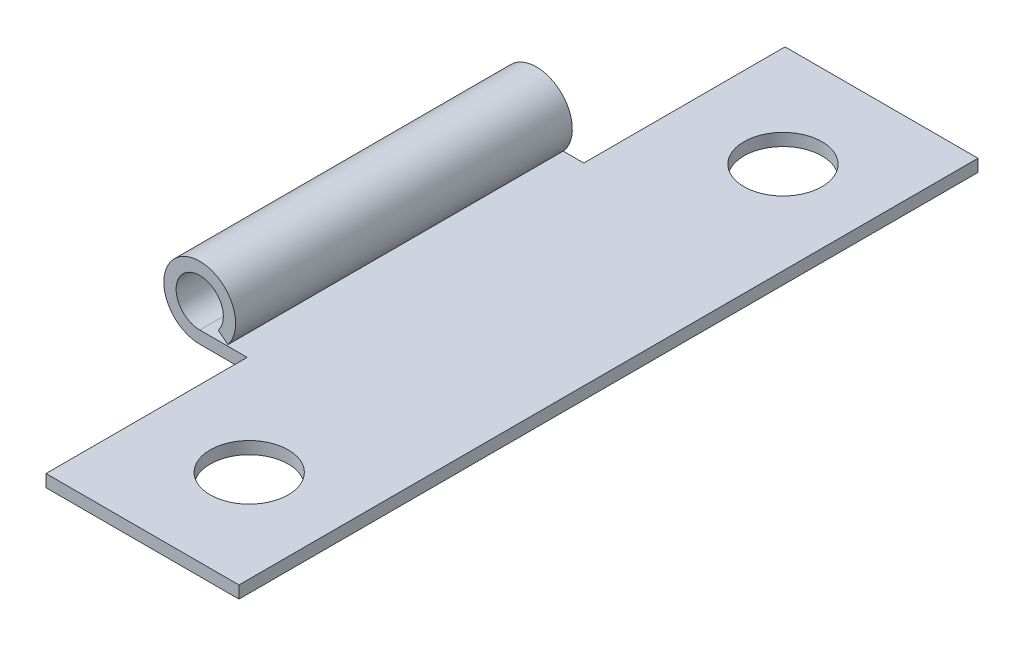
ISO-10303-21;
HEADER;
FILE_DESCRIPTION(('STEP AP214'),'2;1');
FILE_NAME('part.step','',(''),(''),'','','');
FILE_SCHEMA(('AUTOMOTIVE_DESIGN { 1 0 10303 214 1 1 1 1 }'));
ENDSEC;
DATA;
#1=APPLICATION_CONTEXT('core data for automotive mechanical design processes');
#2=APPLICATION_PROTOCOL_DEFINITION('international standard','automotive_design',2000,#1);
#3=PRODUCT_CONTEXT('',#1,'mechanical');
#4=PRODUCT('Part','Part','',(#3));
#5=PRODUCT_RELATED_PRODUCT_CATEGORY('part','',(#4));
#6=PRODUCT_DEFINITION_FORMATION('','',#4);
#7=PRODUCT_DEFINITION_CONTEXT('part definition',#1,'design');
#8=PRODUCT_DEFINITION('design','',#6,#7);
#9=PRODUCT_DEFINITION_SHAPE('','',#8);
#10=(LENGTH_UNIT() NAMED_UNIT(*) SI_UNIT(.MILLI.,.METRE.));
#11=(NAMED_UNIT(*) PLANE_ANGLE_UNIT() SI_UNIT($,.RADIAN.));
#12=(NAMED_UNIT(*) SI_UNIT($,.STERADIAN.) SOLID_ANGLE_UNIT());
#13=UNCERTAINTY_MEASURE_WITH_UNIT(LENGTH_MEASURE(1.E-05),#10,'distance_accuracy_value','');
#14=(GEOMETRIC_REPRESENTATION_CONTEXT(3) GLOBAL_UNCERTAINTY_ASSIGNED_CONTEXT((#13)) GLOBAL_UNIT_ASSIGNED_CONTEXT((#10,
#11,#12)) REPRESENTATION_CONTEXT('',''));
#15=CARTESIAN_POINT('',(0.,0.,0.));
#16=DIRECTION('',(0.,0.,1.));
#17=DIRECTION('',(1.,0.,0.));
#18=AXIS2_PLACEMENT_3D('',#15,#16,#17);
#19=CARTESIAN_POINT('',(-11.7121381015996,0.,36.));
#20=DIRECTION('',(0.,1.,0.));
#21=DIRECTION('',(0.,0.,1.));
#22=AXIS2_PLACEMENT_3D('',#19,#20,#21);
#23=PLANE('',#22);
#24=CARTESIAN_POINT('',(-4.50000000000001,0.,5.));
#25=DIRECTION('',(0.,1.,0.));
#26=DIRECTION('',(-1.,0.,0.));
#27=AXIS2_PLACEMENT_3D('',#24,#25,#26);
#28=CIRCLE('',#27,1.9);
#29=CARTESIAN_POINT('',(-6.40000000000001,0.,5.));
#30=VERTEX_POINT('',#29);
#31=EDGE_CURVE('E155',#30,#30,#28,.T.);
#32=ORIENTED_EDGE('',*,*,#31,.T.);
#33=EDGE_LOOP('',(#32));
#34=FACE_BOUND('',#33,.T.);
#35=CARTESIAN_POINT('',(-4.50000000000001,0.,31.));
#36=DIRECTION('',(0.,1.,0.));
#37=DIRECTION('',(1.,0.,0.));
#38=AXIS2_PLACEMENT_3D('',#35,#36,#37);
#39=CIRCLE('',#38,1.9);
#40=CARTESIAN_POINT('',(-6.40000000000001,0.,31.));
#41=VERTEX_POINT('',#40);
#42=EDGE_CURVE('E162',#41,#41,#39,.T.);
#43=ORIENTED_EDGE('',*,*,#42,.T.);
#44=EDGE_LOOP('',(#43));
#45=FACE_BOUND('',#44,.T.);
#46=DIRECTION('',(1.,0.,0.));
#47=VECTOR('',#46,1.);
#48=CARTESIAN_POINT('',(-11.7121381015996,0.,36.));
#49=LINE('',#48,#47);
#50=CARTESIAN_POINT('',(-9.4,0.,36.));
#51=VERTEX_POINT('',#50);
#52=CARTESIAN_POINT('',(0.,0.,36.));
#53=VERTEX_POINT('',#52);
#54=EDGE_CURVE('E124',#51,#53,#49,.T.);
#55=ORIENTED_EDGE('',*,*,#54,.F.);
#56=DIRECTION('',(0.,0.,-1.));
#57=VECTOR('',#56,1.);
#58=CARTESIAN_POINT('',(-9.4,0.,26.2));
#59=LINE('',#58,#57);
#60=CARTESIAN_POINT('',(-9.4,0.,26.2));
#61=VERTEX_POINT('',#60);
#62=EDGE_CURVE('E46',#51,#61,#59,.T.);
#63=ORIENTED_EDGE('',*,*,#62,.T.);
#64=DIRECTION('',(-1.,0.,0.));
#65=VECTOR('',#64,1.);
#66=CARTESIAN_POINT('',(-9.4,0.,26.2));
#67=LINE('',#66,#65);
#68=CARTESIAN_POINT('',(-11.7121381015996,0.,26.2));
#69=VERTEX_POINT('',#68);
#70=EDGE_CURVE('E113',#61,#69,#67,.T.);
#71=ORIENTED_EDGE('',*,*,#70,.T.);
#72=DIRECTION('',(0.,0.,-1.));
#73=VECTOR('',#72,1.);
#74=CARTESIAN_POINT('',(-11.7121381015996,0.,36.));
#75=LINE('',#74,#73);
#76=CARTESIAN_POINT('',(-11.7121381015996,0.,9.8));
#77=VERTEX_POINT('',#76);
#78=EDGE_CURVE('E174',#69,#77,#75,.T.);
#79=ORIENTED_EDGE('',*,*,#78,.T.);
#80=DIRECTION('',(1.,0.,0.));
#81=VECTOR('',#80,1.);
#82=CARTESIAN_POINT('',(-9.4,0.,9.8));
#83=LINE('',#82,#81);
#84=CARTESIAN_POINT('',(-9.4,0.,9.8));
#85=VERTEX_POINT('',#84);
#86=EDGE_CURVE('E127',#77,#85,#83,.T.);
#87=ORIENTED_EDGE('',*,*,#86,.T.);
#88=DIRECTION('',(0.,0.,-1.));
#89=VECTOR('',#88,1.);
#90=CARTESIAN_POINT('',(-9.4,0.,9.8));
#91=LINE('',#90,#89);
#92=CARTESIAN_POINT('',(-9.4,0.,0.));
#93=VERTEX_POINT('',#92);
#94=EDGE_CURVE('E130',#85,#93,#91,.T.);
#95=ORIENTED_EDGE('',*,*,#94,.T.);
#96=DIRECTION('',(1.,0.,0.));
#97=VECTOR('',#96,1.);
#98=CARTESIAN_POINT('',(-11.7121381015996,0.,0.));
#99=LINE('',#98,#97);
#100=CARTESIAN_POINT('',(0.,0.,0.));
#101=VERTEX_POINT('',#100);
#102=EDGE_CURVE('E158',#93,#101,#99,.T.);
#103=ORIENTED_EDGE('',*,*,#102,.T.);
#104=DIRECTION('',(0.,0.,-1.));
#105=VECTOR('',#104,1.);
#106=CARTESIAN_POINT('',(0.,0.,36.));
#107=LINE('',#106,#105);
#108=EDGE_CURVE('E193',#53,#101,#107,.T.);
#109=ORIENTED_EDGE('',*,*,#108,.F.);
#110=EDGE_LOOP('',(#55,#63,#71,#79,#87,#95,#103,#109));
#111=FACE_BOUND('',#110,.T.);
#112=ADVANCED_FACE('F32',(#34,#45,#111),#23,.F.);
#113=CARTESIAN_POINT('',(0.,0.,36.));
#114=DIRECTION('',(-1.,0.,0.));
#115=DIRECTION('',(0.,0.,1.));
#116=AXIS2_PLACEMENT_3D('',#113,#114,#115);
#117=PLANE('',#116);
#118=DIRECTION('',(0.,1.,0.));
#119=VECTOR('',#118,1.);
#120=CARTESIAN_POINT('',(0.,0.,0.));
#121=LINE('',#120,#119);
#122=CARTESIAN_POINT('',(0.,0.6,0.));
#123=VERTEX_POINT('',#122);
#124=EDGE_CURVE('E176',#101,#123,#121,.T.);
#125=ORIENTED_EDGE('',*,*,#124,.T.);
#126=DIRECTION('',(0.,0.,-1.));
#127=VECTOR('',#126,1.);
#128=CARTESIAN_POINT('',(0.,0.6,36.));
#129=LINE('',#128,#127);
#130=CARTESIAN_POINT('',(0.,0.6,36.));
#131=VERTEX_POINT('',#130);
#132=EDGE_CURVE('E190',#131,#123,#129,.T.);
#133=ORIENTED_EDGE('',*,*,#132,.F.);
#134=DIRECTION('',(0.,1.,0.));
#135=VECTOR('',#134,1.);
#136=CARTESIAN_POINT('',(0.,0.,36.));
#137=LINE('',#136,#135);
#138=EDGE_CURVE('E168',#53,#131,#137,.T.);
#139=ORIENTED_EDGE('',*,*,#138,.F.);
#140=ORIENTED_EDGE('',*,*,#108,.T.);
#141=EDGE_LOOP('',(#125,#133,#139,#140));
#142=FACE_BOUND('',#141,.T.);
#143=ADVANCED_FACE('F214',(#142),#117,.F.);
#144=CARTESIAN_POINT('',(0.,0.6,36.));
#145=DIRECTION('',(0.,-1.,0.));
#146=DIRECTION('',(1.,0.,0.));
#147=AXIS2_PLACEMENT_3D('',#144,#145,#146);
#148=PLANE('',#147);
#149=CARTESIAN_POINT('',(-4.50000000000001,0.600000000000001,5.));
#150=DIRECTION('',(0.,1.,0.));
#151=DIRECTION('',(-1.,0.,0.));
#152=AXIS2_PLACEMENT_3D('',#149,#150,#151);
#153=CIRCLE('',#152,1.9);
#154=CARTESIAN_POINT('',(-6.40000000000001,0.600000000000001,5.));
#155=VERTEX_POINT('',#154);
#156=EDGE_CURVE('E159',#155,#155,#153,.T.);
#157=ORIENTED_EDGE('',*,*,#156,.F.);
#158=EDGE_LOOP('',(#157));
#159=FACE_BOUND('',#158,.T.);
#160=CARTESIAN_POINT('',(-4.50000000000001,0.600000000000001,31.));
#161=DIRECTION('',(0.,1.,0.));
#162=DIRECTION('',(1.,0.,0.));
#163=AXIS2_PLACEMENT_3D('',#160,#161,#162);
#164=CIRCLE('',#163,1.9);
#165=CARTESIAN_POINT('',(-6.40000000000001,0.600000000000001,31.));
#166=VERTEX_POINT('',#165);
#167=EDGE_CURVE('E154',#166,#166,#164,.T.);
#168=ORIENTED_EDGE('',*,*,#167,.F.);
#169=EDGE_LOOP('',(#168));
#170=FACE_BOUND('',#169,.T.);
#171=DIRECTION('',(1.,0.,0.));
#172=VECTOR('',#171,1.);
#173=CARTESIAN_POINT('',(0.,0.6,26.2));
#174=LINE('',#173,#172);
#175=CARTESIAN_POINT('',(-11.7121381015996,0.600000000000001,26.2));
#176=VERTEX_POINT('',#175);
#177=CARTESIAN_POINT('',(-9.4,0.600000000000001,26.2));
#178=VERTEX_POINT('',#177);
#179=EDGE_CURVE('E152',#176,#178,#174,.T.);
#180=ORIENTED_EDGE('',*,*,#179,.T.);
#181=DIRECTION('',(0.,0.,1.));
#182=VECTOR('',#181,1.);
#183=CARTESIAN_POINT('',(-9.4,0.600000000000001,36.));
#184=LINE('',#183,#182);
#185=CARTESIAN_POINT('',(-9.4,0.600000000000001,36.));
#186=VERTEX_POINT('',#185);
#187=EDGE_CURVE('E110',#178,#186,#184,.T.);
#188=ORIENTED_EDGE('',*,*,#187,.T.);
#189=DIRECTION('',(-1.,0.,0.));
#190=VECTOR('',#189,1.);
#191=CARTESIAN_POINT('',(0.,0.6,36.));
#192=LINE('',#191,#190);
#193=EDGE_CURVE('E171',#131,#186,#192,.T.);
#194=ORIENTED_EDGE('',*,*,#193,.F.);
#195=ORIENTED_EDGE('',*,*,#132,.T.);
#196=DIRECTION('',(-1.,0.,0.));
#197=VECTOR('',#196,1.);
#198=CARTESIAN_POINT('',(0.,0.6,0.));
#199=LINE('',#198,#197);
#200=CARTESIAN_POINT('',(-9.4,0.600000000000001,0.));
#201=VERTEX_POINT('',#200);
#202=EDGE_CURVE('E169',#123,#201,#199,.T.);
#203=ORIENTED_EDGE('',*,*,#202,.T.);
#204=DIRECTION('',(0.,0.,1.));
#205=VECTOR('',#204,1.);
#206=CARTESIAN_POINT('',(-9.4,0.600000000000001,36.));
#207=LINE('',#206,#205);
#208=CARTESIAN_POINT('',(-9.4,0.600000000000001,9.8));
#209=VERTEX_POINT('',#208);
#210=EDGE_CURVE('E54',#201,#209,#207,.T.);
#211=ORIENTED_EDGE('',*,*,#210,.T.);
#212=DIRECTION('',(-1.,0.,0.));
#213=VECTOR('',#212,1.);
#214=CARTESIAN_POINT('',(0.,0.6,9.8));
#215=LINE('',#214,#213);
#216=CARTESIAN_POINT('',(-11.7121381015996,0.600000000000001,9.8));
#217=VERTEX_POINT('',#216);
#218=EDGE_CURVE('E143',#209,#217,#215,.T.);
#219=ORIENTED_EDGE('',*,*,#218,.T.);
#220=DIRECTION('',(0.,0.,-1.));
#221=VECTOR('',#220,1.);
#222=CARTESIAN_POINT('',(-11.7121381015996,0.600000000000001,36.));
#223=LINE('',#222,#221);
#224=EDGE_CURVE('E187',#176,#217,#223,.T.);
#225=ORIENTED_EDGE('',*,*,#224,.F.);
#226=EDGE_LOOP('',(#180,#188,#194,#195,#203,#211,#219,#225));
#227=FACE_BOUND('',#226,.T.);
#228=ADVANCED_FACE('F219',(#159,#170,#227),#148,.F.);
#229=CARTESIAN_POINT('',(-11.7121381015996,1.75,36.));
#230=DIRECTION('',(0.,0.,-1.));
#231=DIRECTION('',(-1.,0.,0.));
#232=AXIS2_PLACEMENT_3D('',#229,#230,#231);
#233=CYLINDRICAL_SURFACE('',#232,1.15);
#234=DIRECTION('',(0.,0.,-1.));
#235=VECTOR('',#234,1.);
#236=CARTESIAN_POINT('',(-10.8073046216626,1.04022794251596,36.));
#237=LINE('',#236,#235);
#238=CARTESIAN_POINT('',(-10.8073046216626,1.04022794251596,26.2));
#239=VERTEX_POINT('',#238);
#240=CARTESIAN_POINT('',(-10.8073046216626,1.04022794251596,9.8));
#241=VERTEX_POINT('',#240);
#242=EDGE_CURVE('E184',#239,#241,#237,.T.);
#243=ORIENTED_EDGE('',*,*,#242,.F.);
#244=CARTESIAN_POINT('',(-11.7121381015996,1.75,26.2));
#245=DIRECTION('',(0.,0.,-1.));
#246=DIRECTION('',(-1.,0.,0.));
#247=AXIS2_PLACEMENT_3D('',#244,#245,#246);
#248=CIRCLE('',#247,1.15);
#249=EDGE_CURVE('E149',#239,#176,#248,.F.);
#250=ORIENTED_EDGE('',*,*,#249,.T.);
#251=ORIENTED_EDGE('',*,*,#224,.T.);
#252=CARTESIAN_POINT('',(-11.7121381015996,1.75,9.8));
#253=DIRECTION('',(0.,0.,1.));
#254=DIRECTION('',(1.,0.,0.));
#255=AXIS2_PLACEMENT_3D('',#252,#253,#254);
#256=CIRCLE('',#255,1.15);
#257=EDGE_CURVE('E140',#217,#241,#256,.F.);
#258=ORIENTED_EDGE('',*,*,#257,.T.);
#259=EDGE_LOOP('',(#243,#250,#251,#258));
#260=FACE_BOUND('',#259,.T.);
#261=ADVANCED_FACE('F223',(#260),#233,.F.);
#262=CARTESIAN_POINT('',(-10.8073046216626,1.04022794251596,36.));
#263=DIRECTION('',(0.617193093464386,0.786811721684332,0.));
#264=DIRECTION('',(-0.786811721684332,0.617193093464386,0.));
#265=AXIS2_PLACEMENT_3D('',#262,#263,#264);
#266=PLANE('',#265);
#267=DIRECTION('',(0.,0.,-1.));
#268=VECTOR('',#267,1.);
#269=CARTESIAN_POINT('',(-10.335217588652,0.669912086437324,36.));
#270=LINE('',#269,#268);
#271=CARTESIAN_POINT('',(-10.335217588652,0.669912086437324,26.2));
#272=VERTEX_POINT('',#271);
#273=CARTESIAN_POINT('',(-10.335217588652,0.669912086437324,9.8));
#274=VERTEX_POINT('',#273);
#275=EDGE_CURVE('E181',#272,#274,#270,.T.);
#276=ORIENTED_EDGE('',*,*,#275,.F.);
#277=DIRECTION('',(-0.786811721684332,0.617193093464386,0.));
#278=VECTOR('',#277,1.);
#279=CARTESIAN_POINT('',(-10.8073046216626,1.04022794251596,26.2));
#280=LINE('',#279,#278);
#281=EDGE_CURVE('E146',#272,#239,#280,.T.);
#282=ORIENTED_EDGE('',*,*,#281,.T.);
#283=ORIENTED_EDGE('',*,*,#242,.T.);
#284=DIRECTION('',(0.786811721684332,-0.617193093464386,0.));
#285=VECTOR('',#284,1.);
#286=CARTESIAN_POINT('',(-10.8073046216626,1.04022794251596,9.8));
#287=LINE('',#286,#285);
#288=EDGE_CURVE('E137',#241,#274,#287,.T.);
#289=ORIENTED_EDGE('',*,*,#288,.T.);
#290=EDGE_LOOP('',(#276,#282,#283,#289));
#291=FACE_BOUND('',#290,.T.);
#292=ADVANCED_FACE('F225',(#291),#266,.F.);
#293=CARTESIAN_POINT('',(-11.7121381015996,1.75,36.));
#294=DIRECTION('',(0.,0.,-1.));
#295=DIRECTION('',(-1.,0.,0.));
#296=AXIS2_PLACEMENT_3D('',#293,#294,#295);
#297=CYLINDRICAL_SURFACE('',#296,1.75);
#298=CARTESIAN_POINT('',(-11.7121381015996,1.75,26.2));
#299=DIRECTION('',(0.,0.,-1.));
#300=DIRECTION('',(-1.,0.,0.));
#301=AXIS2_PLACEMENT_3D('',#298,#299,#300);
#302=CIRCLE('',#301,1.75);
#303=EDGE_CURVE('E11',#69,#272,#302,.T.);
#304=ORIENTED_EDGE('',*,*,#303,.T.);
#305=ORIENTED_EDGE('',*,*,#275,.T.);
#306=CARTESIAN_POINT('',(-11.7121381015996,1.75,9.8));
#307=DIRECTION('',(0.,0.,1.));
#308=DIRECTION('',(1.,0.,0.));
#309=AXIS2_PLACEMENT_3D('',#306,#307,#308);
#310=CIRCLE('',#309,1.75);
#311=EDGE_CURVE('E39',#274,#77,#310,.T.);
#312=ORIENTED_EDGE('',*,*,#311,.T.);
#313=ORIENTED_EDGE('',*,*,#78,.F.);
#314=EDGE_LOOP('',(#304,#305,#312,#313));
#315=FACE_BOUND('',#314,.T.);
#316=ADVANCED_FACE('F201',(#315),#297,.T.);
#317=CARTESIAN_POINT('',(-11.7121381015996,1.75,36.));
#318=DIRECTION('',(0.,0.,-1.));
#319=DIRECTION('',(-1.,0.,0.));
#320=AXIS2_PLACEMENT_3D('',#317,#318,#319);
#321=PLANE('',#320);
#322=ORIENTED_EDGE('',*,*,#193,.T.);
#323=DIRECTION('',(0.,-1.,0.));
#324=VECTOR('',#323,1.);
#325=CARTESIAN_POINT('',(-9.4,1.75,36.));
#326=LINE('',#325,#324);
#327=EDGE_CURVE('E198',#186,#51,#326,.T.);
#328=ORIENTED_EDGE('',*,*,#327,.T.);
#329=ORIENTED_EDGE('',*,*,#54,.T.);
#330=ORIENTED_EDGE('',*,*,#138,.T.);
#331=EDGE_LOOP('',(#322,#328,#329,#330));
#332=FACE_BOUND('',#331,.T.);
#333=ADVANCED_FACE('F217',(#332),#321,.F.);
#334=CARTESIAN_POINT('',(-11.7121381015996,1.75,0.));
#335=DIRECTION('',(0.,0.,-1.));
#336=DIRECTION('',(-1.,0.,0.));
#337=AXIS2_PLACEMENT_3D('',#334,#335,#336);
#338=PLANE('',#337);
#339=DIRECTION('',(0.,-1.,0.));
#340=VECTOR('',#339,1.);
#341=CARTESIAN_POINT('',(-9.4,1.75,0.));
#342=LINE('',#341,#340);
#343=EDGE_CURVE('E196',#201,#93,#342,.T.);
#344=ORIENTED_EDGE('',*,*,#343,.F.);
#345=ORIENTED_EDGE('',*,*,#202,.F.);
#346=ORIENTED_EDGE('',*,*,#124,.F.);
#347=ORIENTED_EDGE('',*,*,#102,.F.);
#348=EDGE_LOOP('',(#344,#345,#346,#347));
#349=FACE_BOUND('',#348,.T.);
#350=ADVANCED_FACE('F209',(#349),#338,.T.);
#351=CARTESIAN_POINT('',(-4.50000000000001,0.,31.));
#352=DIRECTION('',(0.,1.,0.));
#353=DIRECTION('',(-1.,0.,0.));
#354=AXIS2_PLACEMENT_3D('',#351,#352,#353);
#355=CYLINDRICAL_SURFACE('',#354,1.9);
#356=CARTESIAN_POINT('',(-6.40000000000001,0.,31.));
#357=CARTESIAN_POINT('',(-6.40000000000001,0.00624999999999882,31.));
#358=CARTESIAN_POINT('',(-6.40000000000001,0.0124999999999988,31.));
#359=CARTESIAN_POINT('',(-6.40000000000001,0.0249999999999989,31.));
#360=CARTESIAN_POINT('',(-6.40000000000001,0.0312499999999989,31.));
#361=CARTESIAN_POINT('',(-6.40000000000001,0.0437499999999989,31.));
#362=CARTESIAN_POINT('',(-6.40000000000001,0.049999999999999,31.));
#363=CARTESIAN_POINT('',(-6.40000000000001,0.062499999999999,31.));
#364=CARTESIAN_POINT('',(-6.40000000000001,0.068749999999999,31.));
#365=CARTESIAN_POINT('',(-6.40000000000001,0.0812499999999991,31.));
#366=CARTESIAN_POINT('',(-6.40000000000001,0.0874999999999991,31.));
#367=CARTESIAN_POINT('',(-6.40000000000001,0.0999999999999991,31.));
#368=CARTESIAN_POINT('',(-6.40000000000001,0.106249999999999,31.));
#369=CARTESIAN_POINT('',(-6.40000000000001,0.118749999999999,31.));
#370=CARTESIAN_POINT('',(-6.40000000000001,0.124999999999999,31.));
#371=CARTESIAN_POINT('',(-6.40000000000001,0.137499999999999,31.));
#372=CARTESIAN_POINT('',(-6.40000000000001,0.143749999999999,31.));
#373=CARTESIAN_POINT('',(-6.40000000000001,0.156249999999999,31.));
#374=CARTESIAN_POINT('',(-6.40000000000001,0.162499999999999,31.));
#375=CARTESIAN_POINT('',(-6.40000000000001,0.174999999999999,31.));
#376=CARTESIAN_POINT('',(-6.40000000000001,0.181249999999999,31.));
#377=CARTESIAN_POINT('',(-6.40000000000001,0.193749999999999,31.));
#378=CARTESIAN_POINT('',(-6.40000000000001,0.199999999999999,31.));
#379=CARTESIAN_POINT('',(-6.40000000000001,0.212499999999999,31.));
#380=CARTESIAN_POINT('',(-6.40000000000001,0.21875,31.));
#381=CARTESIAN_POINT('',(-6.40000000000001,0.23125,31.));
#382=CARTESIAN_POINT('',(-6.40000000000001,0.2375,31.));
#383=CARTESIAN_POINT('',(-6.40000000000001,0.25,31.));
#384=CARTESIAN_POINT('',(-6.40000000000001,0.25625,31.));
#385=CARTESIAN_POINT('',(-6.40000000000001,0.26875,31.));
#386=CARTESIAN_POINT('',(-6.40000000000001,0.275,31.));
#387=CARTESIAN_POINT('',(-6.40000000000001,0.2875,31.));
#388=CARTESIAN_POINT('',(-6.40000000000001,0.29375,31.));
#389=CARTESIAN_POINT('',(-6.40000000000001,0.30625,31.));
#390=CARTESIAN_POINT('',(-6.40000000000001,0.3125,31.));
#391=CARTESIAN_POINT('',(-6.40000000000001,0.325,31.));
#392=CARTESIAN_POINT('',(-6.40000000000001,0.33125,31.));
#393=CARTESIAN_POINT('',(-6.40000000000001,0.34375,31.));
#394=CARTESIAN_POINT('',(-6.40000000000001,0.35,31.));
#395=CARTESIAN_POINT('',(-6.40000000000001,0.3625,31.));
#396=CARTESIAN_POINT('',(-6.40000000000001,0.36875,31.));
#397=CARTESIAN_POINT('',(-6.40000000000001,0.38125,31.));
#398=CARTESIAN_POINT('',(-6.40000000000001,0.3875,31.));
#399=CARTESIAN_POINT('',(-6.40000000000001,0.4,31.));
#400=CARTESIAN_POINT('',(-6.40000000000001,0.40625,31.));
#401=CARTESIAN_POINT('',(-6.40000000000001,0.41875,31.));
#402=CARTESIAN_POINT('',(-6.40000000000001,0.425,31.));
#403=CARTESIAN_POINT('',(-6.40000000000001,0.4375,31.));
#404=CARTESIAN_POINT('',(-6.40000000000001,0.44375,31.));
#405=CARTESIAN_POINT('',(-6.40000000000001,0.45625,31.));
#406=CARTESIAN_POINT('',(-6.40000000000001,0.4625,31.));
#407=CARTESIAN_POINT('',(-6.40000000000001,0.475,31.));
#408=CARTESIAN_POINT('',(-6.40000000000001,0.48125,31.));
#409=CARTESIAN_POINT('',(-6.40000000000001,0.49375,31.));
#410=CARTESIAN_POINT('',(-6.40000000000001,0.5,31.));
#411=CARTESIAN_POINT('',(-6.40000000000001,0.512500000000001,31.));
#412=CARTESIAN_POINT('',(-6.40000000000001,0.51875,31.));
#413=CARTESIAN_POINT('',(-6.40000000000001,0.53125,31.));
#414=CARTESIAN_POINT('',(-6.40000000000001,0.537500000000001,31.));
#415=CARTESIAN_POINT('',(-6.40000000000001,0.550000000000001,31.));
#416=CARTESIAN_POINT('',(-6.40000000000001,0.556250000000001,31.));
#417=CARTESIAN_POINT('',(-6.40000000000001,0.568750000000001,31.));
#418=CARTESIAN_POINT('',(-6.40000000000001,0.575000000000001,31.));
#419=CARTESIAN_POINT('',(-6.40000000000001,0.587500000000001,31.));
#420=CARTESIAN_POINT('',(-6.40000000000001,0.593750000000001,31.));
#421=CARTESIAN_POINT('',(-6.40000000000001,0.600000000000001,31.));
#422=B_SPLINE_CURVE_WITH_KNOTS('',3,(#356,#357,#358,#359,#360,#361,#362,#363,#364,#365,#366,
#367,#368,#369,#370,#371,#372,#373,#374,#375,#376,#377,#378,#379,#380,#381,#382,#383,#384,#385,
#386,#387,#388,#389,#390,#391,#392,#393,#394,#395,#396,#397,#398,#399,#400,#401,#402,#403,#404,
#405,#406,#407,#408,#409,#410,#411,#412,#413,#414,#415,#416,#417,#418,#419,#420,#421),
.UNSPECIFIED.,.F.,.F.,(4,2,2,2,2,2,2,2,2,2,2,2,2,2,2,2,2,2,2,2,2,2,2,2,2,2,2,2,2,2,2,2,4),(0.,
0.0187500000000001,0.0375000000000001,0.0562500000000002,0.0750000000000002,0.0937500000000003,
0.1125,0.13125,0.15,0.168750000000001,0.187500000000001,0.206250000000001,0.225000000000001,
0.243750000000001,0.262500000000001,0.281250000000001,0.300000000000001,0.318750000000001,
0.337500000000001,0.356250000000001,0.375000000000001,0.393750000000001,0.412500000000001,
0.431250000000001,0.450000000000002,0.468750000000002,0.487500000000002,0.506250000000002,
0.525000000000002,0.543750000000002,0.562500000000002,0.581250000000002,0.600000000000002),.UNSPECIFIED.);
#423=EDGE_CURVE('BSEAM246',#41,#166,#422,.T.);
#424=ORIENTED_EDGE('',*,*,#42,.F.);
#425=ORIENTED_EDGE('',*,*,#167,.T.);
#426=ORIENTED_EDGE('',*,*,#423,.T.);
#427=ORIENTED_EDGE('',*,*,#423,.F.);
#428=EDGE_LOOP('',(#424,#426,#425,#427));
#429=FACE_BOUND('',#428,.T.);
#430=ADVANCED_FACE('F246',(#429),#355,.F.);
#431=CARTESIAN_POINT('',(-4.50000000000001,0.,5.));
#432=DIRECTION('',(0.,1.,0.));
#433=DIRECTION('',(-1.,0.,0.));
#434=AXIS2_PLACEMENT_3D('',#431,#432,#433);
#435=CYLINDRICAL_SURFACE('',#434,1.9);
#436=CARTESIAN_POINT('',(-6.40000000000001,0.,5.));
#437=CARTESIAN_POINT('',(-6.40000000000001,0.00624999999999882,5.));
#438=CARTESIAN_POINT('',(-6.40000000000001,0.0124999999999988,5.));
#439=CARTESIAN_POINT('',(-6.40000000000001,0.0249999999999989,5.));
#440=CARTESIAN_POINT('',(-6.40000000000001,0.0312499999999989,5.));
#441=CARTESIAN_POINT('',(-6.40000000000001,0.0437499999999989,5.));
#442=CARTESIAN_POINT('',(-6.40000000000001,0.049999999999999,5.));
#443=CARTESIAN_POINT('',(-6.40000000000001,0.062499999999999,5.));
#444=CARTESIAN_POINT('',(-6.40000000000001,0.068749999999999,5.));
#445=CARTESIAN_POINT('',(-6.40000000000001,0.0812499999999991,5.));
#446=CARTESIAN_POINT('',(-6.40000000000001,0.0874999999999991,5.));
#447=CARTESIAN_POINT('',(-6.40000000000001,0.0999999999999991,5.));
#448=CARTESIAN_POINT('',(-6.40000000000001,0.106249999999999,5.));
#449=CARTESIAN_POINT('',(-6.40000000000001,0.118749999999999,5.));
#450=CARTESIAN_POINT('',(-6.40000000000001,0.124999999999999,5.));
#451=CARTESIAN_POINT('',(-6.40000000000001,0.137499999999999,5.));
#452=CARTESIAN_POINT('',(-6.40000000000001,0.143749999999999,5.));
#453=CARTESIAN_POINT('',(-6.40000000000001,0.156249999999999,5.));
#454=CARTESIAN_POINT('',(-6.40000000000001,0.162499999999999,5.));
#455=CARTESIAN_POINT('',(-6.40000000000001,0.174999999999999,5.));
#456=CARTESIAN_POINT('',(-6.40000000000001,0.181249999999999,5.));
#457=CARTESIAN_POINT('',(-6.40000000000001,0.193749999999999,5.));
#458=CARTESIAN_POINT('',(-6.40000000000001,0.199999999999999,5.));
#459=CARTESIAN_POINT('',(-6.40000000000001,0.212499999999999,5.));
#460=CARTESIAN_POINT('',(-6.40000000000001,0.21875,5.));
#461=CARTESIAN_POINT('',(-6.40000000000001,0.23125,5.));
#462=CARTESIAN_POINT('',(-6.40000000000001,0.2375,5.));
#463=CARTESIAN_POINT('',(-6.40000000000001,0.25,5.));
#464=CARTESIAN_POINT('',(-6.40000000000001,0.25625,5.));
#465=CARTESIAN_POINT('',(-6.40000000000001,0.26875,5.));
#466=CARTESIAN_POINT('',(-6.40000000000001,0.275,5.));
#467=CARTESIAN_POINT('',(-6.40000000000001,0.2875,5.));
#468=CARTESIAN_POINT('',(-6.40000000000001,0.29375,5.));
#469=CARTESIAN_POINT('',(-6.40000000000001,0.30625,5.));
#470=CARTESIAN_POINT('',(-6.40000000000001,0.3125,5.));
#471=CARTESIAN_POINT('',(-6.40000000000001,0.325,5.));
#472=CARTESIAN_POINT('',(-6.40000000000001,0.33125,5.));
#473=CARTESIAN_POINT('',(-6.40000000000001,0.34375,5.));
#474=CARTESIAN_POINT('',(-6.40000000000001,0.35,5.));
#475=CARTESIAN_POINT('',(-6.40000000000001,0.3625,5.));
#476=CARTESIAN_POINT('',(-6.40000000000001,0.36875,5.));
#477=CARTESIAN_POINT('',(-6.40000000000001,0.38125,5.));
#478=CARTESIAN_POINT('',(-6.40000000000001,0.3875,5.));
#479=CARTESIAN_POINT('',(-6.40000000000001,0.4,5.));
#480=CARTESIAN_POINT('',(-6.40000000000001,0.40625,5.));
#481=CARTESIAN_POINT('',(-6.40000000000001,0.41875,5.));
#482=CARTESIAN_POINT('',(-6.40000000000001,0.425,5.));
#483=CARTESIAN_POINT('',(-6.40000000000001,0.4375,5.));
#484=CARTESIAN_POINT('',(-6.40000000000001,0.44375,5.));
#485=CARTESIAN_POINT('',(-6.40000000000001,0.45625,5.));
#486=CARTESIAN_POINT('',(-6.40000000000001,0.4625,5.));
#487=CARTESIAN_POINT('',(-6.40000000000001,0.475,5.));
#488=CARTESIAN_POINT('',(-6.40000000000001,0.48125,5.));
#489=CARTESIAN_POINT('',(-6.40000000000001,0.49375,5.));
#490=CARTESIAN_POINT('',(-6.40000000000001,0.5,5.));
#491=CARTESIAN_POINT('',(-6.40000000000001,0.512500000000001,5.));
#492=CARTESIAN_POINT('',(-6.40000000000001,0.51875,5.));
#493=CARTESIAN_POINT('',(-6.40000000000001,0.53125,5.));
#494=CARTESIAN_POINT('',(-6.40000000000001,0.537500000000001,5.));
#495=CARTESIAN_POINT('',(-6.40000000000001,0.550000000000001,5.));
#496=CARTESIAN_POINT('',(-6.40000000000001,0.556250000000001,5.));
#497=CARTESIAN_POINT('',(-6.40000000000001,0.568750000000001,5.));
#498=CARTESIAN_POINT('',(-6.40000000000001,0.575000000000001,5.));
#499=CARTESIAN_POINT('',(-6.40000000000001,0.587500000000001,5.));
#500=CARTESIAN_POINT('',(-6.40000000000001,0.593750000000001,5.));
#501=CARTESIAN_POINT('',(-6.40000000000001,0.600000000000001,5.));
#502=B_SPLINE_CURVE_WITH_KNOTS('',3,(#436,#437,#438,#439,#440,#441,#442,#443,#444,#445,#446,
#447,#448,#449,#450,#451,#452,#453,#454,#455,#456,#457,#458,#459,#460,#461,#462,#463,#464,#465,
#466,#467,#468,#469,#470,#471,#472,#473,#474,#475,#476,#477,#478,#479,#480,#481,#482,#483,#484,
#485,#486,#487,#488,#489,#490,#491,#492,#493,#494,#495,#496,#497,#498,#499,#500,#501),
.UNSPECIFIED.,.F.,.F.,(4,2,2,2,2,2,2,2,2,2,2,2,2,2,2,2,2,2,2,2,2,2,2,2,2,2,2,2,2,2,2,2,4),(0.,
0.0187500000000001,0.0375000000000001,0.0562500000000002,0.0750000000000002,0.0937500000000003,
0.1125,0.13125,0.15,0.168750000000001,0.187500000000001,0.206250000000001,0.225000000000001,
0.243750000000001,0.262500000000001,0.281250000000001,0.300000000000001,0.318750000000001,
0.337500000000001,0.356250000000001,0.375000000000001,0.393750000000001,0.412500000000001,
0.431250000000001,0.450000000000002,0.468750000000002,0.487500000000002,0.506250000000002,
0.525000000000002,0.543750000000002,0.562500000000002,0.581250000000002,0.600000000000002),.UNSPECIFIED.);
#503=EDGE_CURVE('BSEAM234',#30,#155,#502,.T.);
#504=ORIENTED_EDGE('',*,*,#31,.F.);
#505=ORIENTED_EDGE('',*,*,#156,.T.);
#506=ORIENTED_EDGE('',*,*,#503,.T.);
#507=ORIENTED_EDGE('',*,*,#503,.F.);
#508=EDGE_LOOP('',(#504,#506,#505,#507));
#509=FACE_BOUND('',#508,.T.);
#510=ADVANCED_FACE('F234',(#509),#435,.F.);
#511=CARTESIAN_POINT('',(-9.4,0.,9.8));
#512=DIRECTION('',(0.,0.,1.));
#513=DIRECTION('',(1.,0.,0.));
#514=AXIS2_PLACEMENT_3D('',#511,#512,#513);
#515=PLANE('',#514);
#516=DIRECTION('',(0.,1.,0.));
#517=VECTOR('',#516,1.);
#518=CARTESIAN_POINT('',(-9.4,0.,9.8));
#519=LINE('',#518,#517);
#520=EDGE_CURVE('E125',#85,#209,#519,.T.);
#521=ORIENTED_EDGE('',*,*,#520,.F.);
#522=ORIENTED_EDGE('',*,*,#86,.F.);
#523=ORIENTED_EDGE('',*,*,#311,.F.);
#524=ORIENTED_EDGE('',*,*,#288,.F.);
#525=ORIENTED_EDGE('',*,*,#257,.F.);
#526=ORIENTED_EDGE('',*,*,#218,.F.);
#527=EDGE_LOOP('',(#521,#522,#523,#524,#525,#526));
#528=FACE_BOUND('',#527,.T.);
#529=ADVANCED_FACE('F204',(#528),#515,.F.);
#530=CARTESIAN_POINT('',(-9.4,0.,9.8));
#531=DIRECTION('',(1.,0.,0.));
#532=DIRECTION('',(0.,1.,0.));
#533=AXIS2_PLACEMENT_3D('',#530,#531,#532);
#534=PLANE('',#533);
#535=ORIENTED_EDGE('',*,*,#343,.T.);
#536=ORIENTED_EDGE('',*,*,#94,.F.);
#537=ORIENTED_EDGE('',*,*,#520,.T.);
#538=ORIENTED_EDGE('',*,*,#210,.F.);
#539=EDGE_LOOP('',(#535,#536,#537,#538));
#540=FACE_BOUND('',#539,.T.);
#541=ADVANCED_FACE('F226',(#540),#534,.F.);
#542=CARTESIAN_POINT('',(-9.4,0.,26.2));
#543=DIRECTION('',(0.,0.,-1.));
#544=DIRECTION('',(-1.,0.,0.));
#545=AXIS2_PLACEMENT_3D('',#542,#543,#544);
#546=PLANE('',#545);
#547=ORIENTED_EDGE('',*,*,#249,.F.);
#548=ORIENTED_EDGE('',*,*,#281,.F.);
#549=ORIENTED_EDGE('',*,*,#303,.F.);
#550=ORIENTED_EDGE('',*,*,#70,.F.);
#551=DIRECTION('',(0.,1.,0.));
#552=VECTOR('',#551,1.);
#553=CARTESIAN_POINT('',(-9.4,0.,26.2));
#554=LINE('',#553,#552);
#555=EDGE_CURVE('E106',#61,#178,#554,.T.);
#556=ORIENTED_EDGE('',*,*,#555,.T.);
#557=ORIENTED_EDGE('',*,*,#179,.F.);
#558=EDGE_LOOP('',(#547,#548,#549,#550,#556,#557));
#559=FACE_BOUND('',#558,.T.);
#560=ADVANCED_FACE('F116',(#559),#546,.F.);
#561=CARTESIAN_POINT('',(-9.4,0.,26.2));
#562=DIRECTION('',(1.,0.,0.));
#563=DIRECTION('',(0.,1.,0.));
#564=AXIS2_PLACEMENT_3D('',#561,#562,#563);
#565=PLANE('',#564);
#566=ORIENTED_EDGE('',*,*,#555,.F.);
#567=ORIENTED_EDGE('',*,*,#62,.F.);
#568=ORIENTED_EDGE('',*,*,#327,.F.);
#569=ORIENTED_EDGE('',*,*,#187,.F.);
#570=EDGE_LOOP('',(#566,#567,#568,#569));
#571=FACE_BOUND('',#570,.T.);
#572=ADVANCED_FACE('F108',(#571),#565,.F.);
#573=CLOSED_SHELL('',(#112,#143,#228,#261,#292,#316,#333,#350,#430,#510,#529,#541,#560,#572));
#574=MANIFOLD_SOLID_BREP('B2',#573);
#575=ADVANCED_BREP_SHAPE_REPRESENTATION('',(#18,#574),#14);
#576=SHAPE_DEFINITION_REPRESENTATION(#9,#575);
ENDSEC;
END-ISO-10303-21;
